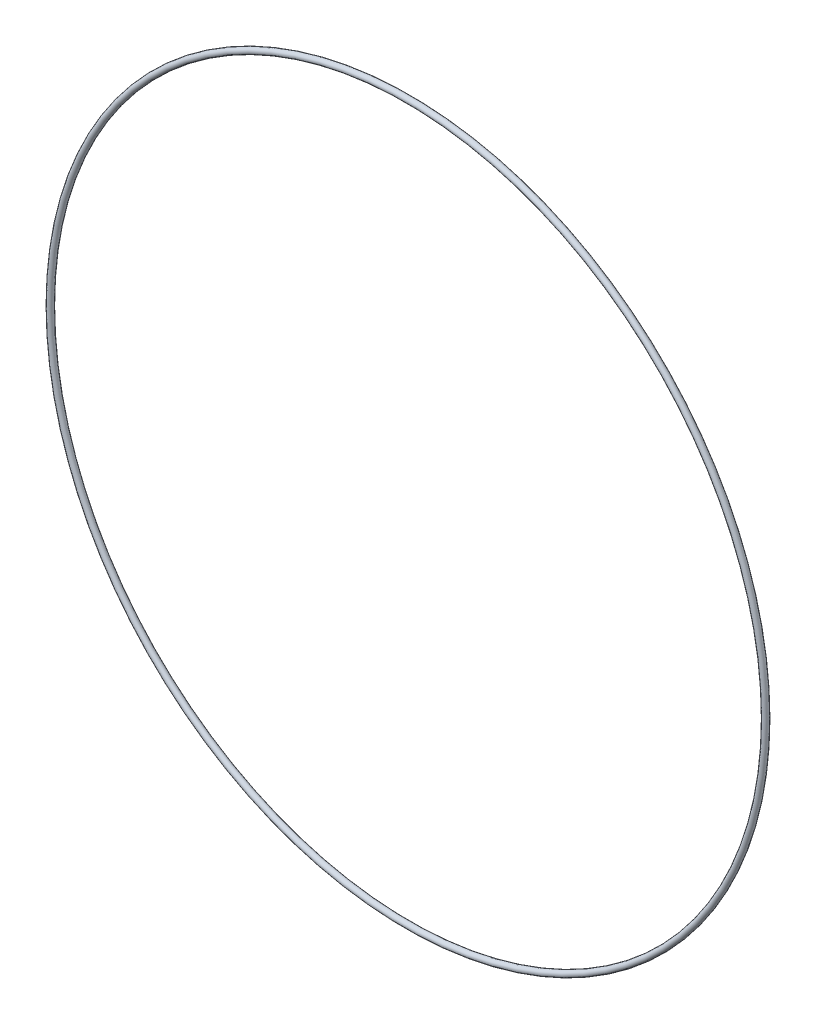
ISO-10303-21;
HEADER;
FILE_DESCRIPTION(('STEP AP214'),'2;1');
FILE_NAME('part.step','',(''),(''),'','','');
FILE_SCHEMA(('AUTOMOTIVE_DESIGN { 1 0 10303 214 1 1 1 1 }'));
ENDSEC;
DATA;
#1=APPLICATION_CONTEXT('core data for automotive mechanical design processes');
#2=APPLICATION_PROTOCOL_DEFINITION('international standard','automotive_design',2000,#1);
#3=PRODUCT_CONTEXT('',#1,'mechanical');
#4=PRODUCT('Part','Part','',(#3));
#5=PRODUCT_RELATED_PRODUCT_CATEGORY('part','',(#4));
#6=PRODUCT_DEFINITION_FORMATION('','',#4);
#7=PRODUCT_DEFINITION_CONTEXT('part definition',#1,'design');
#8=PRODUCT_DEFINITION('design','',#6,#7);
#9=PRODUCT_DEFINITION_SHAPE('','',#8);
#10=(LENGTH_UNIT() NAMED_UNIT(*) SI_UNIT(.MILLI.,.METRE.));
#11=(NAMED_UNIT(*) PLANE_ANGLE_UNIT() SI_UNIT($,.RADIAN.));
#12=(NAMED_UNIT(*) SI_UNIT($,.STERADIAN.) SOLID_ANGLE_UNIT());
#13=UNCERTAINTY_MEASURE_WITH_UNIT(LENGTH_MEASURE(1.E-05),#10,'distance_accuracy_value','');
#14=(GEOMETRIC_REPRESENTATION_CONTEXT(3) GLOBAL_UNCERTAINTY_ASSIGNED_CONTEXT((#13)) GLOBAL_UNIT_ASSIGNED_CONTEXT((#10,
#11,#12)) REPRESENTATION_CONTEXT('',''));
#15=CARTESIAN_POINT('',(0.,0.,0.));
#16=DIRECTION('',(0.,0.,1.));
#17=DIRECTION('',(1.,0.,0.));
#18=AXIS2_PLACEMENT_3D('',#15,#16,#17);
#19=CARTESIAN_POINT('',(0.,0.,0.));
#20=DIRECTION('',(0.,0.,1.));
#21=DIRECTION('',(1.,0.,0.));
#22=AXIS2_PLACEMENT_3D('',#19,#20,#21);
#23=TOROIDAL_SURFACE('',#22,118.,1.);
#24=CARTESIAN_POINT('',(119.,0.,0.));
#25=VERTEX_POINT('',#24);
#26=VERTEX_LOOP('',#25);
#27=FACE_BOUND('',#26,.T.);
#28=ADVANCED_FACE('F39',(#27),#23,.T.);
#29=CLOSED_SHELL('',(#28));
#30=MANIFOLD_SOLID_BREP('B2',#29);
#31=ADVANCED_BREP_SHAPE_REPRESENTATION('',(#18,#30),#14);
#32=SHAPE_DEFINITION_REPRESENTATION(#9,#31);
ENDSEC;
END-ISO-10303-21;
